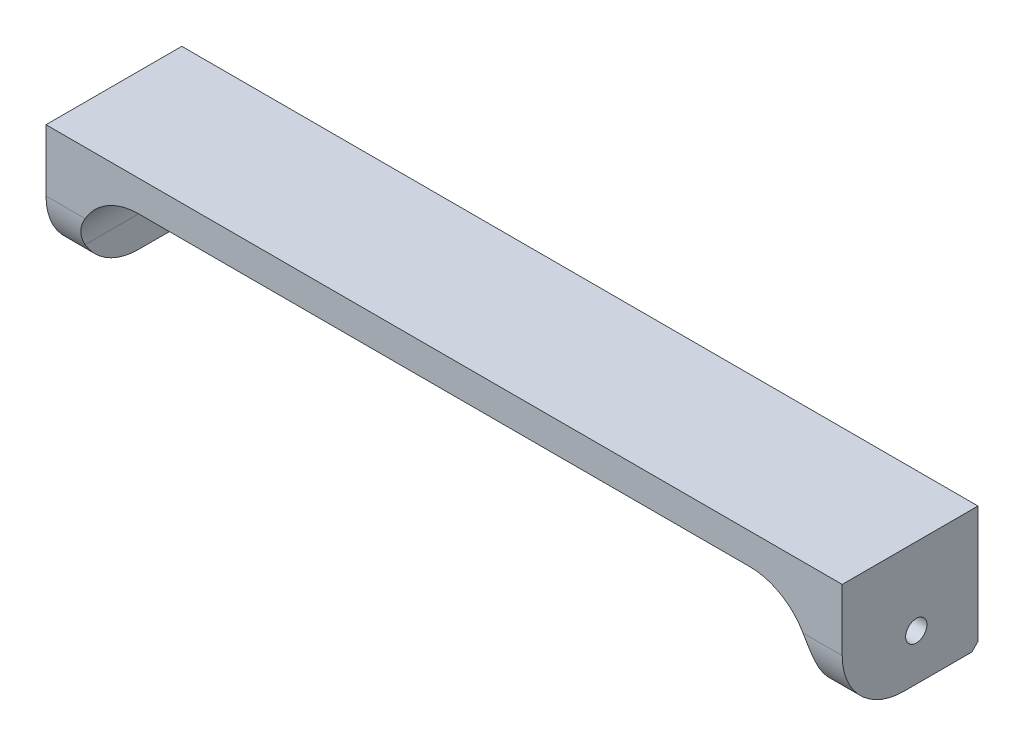
ISO-10303-21;
HEADER;
FILE_DESCRIPTION(('STEP AP214'),'2;1');
FILE_NAME('part.step','',(''),(''),'','','');
FILE_SCHEMA(('AUTOMOTIVE_DESIGN { 1 0 10303 214 1 1 1 1 }'));
ENDSEC;
DATA;
#1=APPLICATION_CONTEXT('core data for automotive mechanical design processes');
#2=APPLICATION_PROTOCOL_DEFINITION('international standard','automotive_design',2000,#1);
#3=PRODUCT_CONTEXT('',#1,'mechanical');
#4=PRODUCT('Part','Part','',(#3));
#5=PRODUCT_RELATED_PRODUCT_CATEGORY('part','',(#4));
#6=PRODUCT_DEFINITION_FORMATION('','',#4);
#7=PRODUCT_DEFINITION_CONTEXT('part definition',#1,'design');
#8=PRODUCT_DEFINITION('design','',#6,#7);
#9=PRODUCT_DEFINITION_SHAPE('','',#8);
#10=(LENGTH_UNIT() NAMED_UNIT(*) SI_UNIT(.MILLI.,.METRE.));
#11=(NAMED_UNIT(*) PLANE_ANGLE_UNIT() SI_UNIT($,.RADIAN.));
#12=(NAMED_UNIT(*) SI_UNIT($,.STERADIAN.) SOLID_ANGLE_UNIT());
#13=UNCERTAINTY_MEASURE_WITH_UNIT(LENGTH_MEASURE(1.E-05),#10,'distance_accuracy_value','');
#14=(GEOMETRIC_REPRESENTATION_CONTEXT(3) GLOBAL_UNCERTAINTY_ASSIGNED_CONTEXT((#13)) GLOBAL_UNIT_ASSIGNED_CONTEXT((#10,
#11,#12)) REPRESENTATION_CONTEXT('',''));
#15=CARTESIAN_POINT('',(0.,0.,0.));
#16=DIRECTION('',(0.,0.,1.));
#17=DIRECTION('',(1.,0.,0.));
#18=AXIS2_PLACEMENT_3D('',#15,#16,#17);
#19=CARTESIAN_POINT('',(49.5,-4.99999999999999,22.));
#20=DIRECTION('',(0.,0.,1.));
#21=DIRECTION('',(1.,0.,0.));
#22=AXIS2_PLACEMENT_3D('',#19,#20,#21);
#23=CYLINDRICAL_SURFACE('',#22,10.);
#24=DIRECTION('',(0.,0.,-1.));
#25=VECTOR('',#24,1.);
#26=CARTESIAN_POINT('',(59.5,-5.,0.));
#27=LINE('',#26,#25);
#28=CARTESIAN_POINT('',(59.5,-5.,20.6602540378444));
#29=VERTEX_POINT('',#28);
#30=CARTESIAN_POINT('',(59.5,-5.,11.260952021292));
#31=VERTEX_POINT('',#30);
#32=EDGE_CURVE('E155',#29,#31,#27,.T.);
#33=ORIENTED_EDGE('',*,*,#32,.F.);
#34=CARTESIAN_POINT('',(59.5,-5.,20.6602540378444));
#35=CARTESIAN_POINT('',(59.5000313996255,-4.81645175072484,20.7662718814835));
#36=CARTESIAN_POINT('',(59.4949471616041,-4.6294539116396,20.86640852136));
#37=CARTESIAN_POINT('',(59.4736335686128,-4.24992862680902,21.0544331322078));
#38=CARTESIAN_POINT('',(59.4573997527731,-4.05739899738466,21.1423161836656));
#39=CARTESIAN_POINT('',(59.4128771806947,-3.66837705293614,21.3052414974577));
#40=CARTESIAN_POINT('',(59.3845914045659,-3.47188572896254,21.3802869277489));
#41=CARTESIAN_POINT('',(59.3153372898342,-3.07662047107035,21.5172543556601));
#42=CARTESIAN_POINT('',(59.2743716752571,-2.87784703624379,21.5791791671904));
#43=CARTESIAN_POINT('',(59.1792412390279,-2.47920724986116,21.6900182662066));
#44=CARTESIAN_POINT('',(59.1250403296062,-2.27933939602253,21.738896203786));
#45=CARTESIAN_POINT('',(59.0033923742944,-1.88087787742971,21.8236341090356));
#46=CARTESIAN_POINT('',(58.9359451159728,-1.68228423316275,21.8594938679073));
#47=CARTESIAN_POINT('',(58.7881365827815,-1.28857892795217,21.9186246526666));
#48=CARTESIAN_POINT('',(58.7078039596746,-1.093460584731,21.9419231197314));
#49=CARTESIAN_POINT('',(58.5345340007195,-0.707935523708524,21.9767859771012));
#50=CARTESIAN_POINT('',(58.4416037679711,-0.517526221766811,21.9883569489533));
#51=CARTESIAN_POINT('',(58.313306088011,-0.274579323430887,21.9963848272747));
#52=CARTESIAN_POINT('',(58.283408887104,-0.219237542971276,21.9977482862739));
#53=CARTESIAN_POINT('',(58.2225971060538,-0.109167232927088,21.9995552900602));
#54=CARTESIAN_POINT('',(58.191683490552,-0.0544381843972345,21.9999996828777));
#55=CARTESIAN_POINT('',(58.1602540378444,0.,22.));
#56=B_SPLINE_CURVE_WITH_KNOTS('',3,(#34,#35,#36,#37,#38,#39,#40,#41,#42,#43,#44,#45,#46,#47,#48,
#49,#50,#51,#52,#53,#54,#55),.UNSPECIFIED.,.F.,.F.,(4,2,2,2,2,2,2,2,2,2,4),(0.,0.63579780688267,
1.27185014041099,1.9077452873184,2.54350391876901,3.18101577473809,3.81853785530785,
4.45466151434951,5.09042797861825,5.27916429152553,5.46772637792503),.UNSPECIFIED.);
#57=CARTESIAN_POINT('',(58.1602540378444,0.,22.));
#58=VERTEX_POINT('',#57);
#59=EDGE_CURVE('E243',#29,#58,#56,.T.);
#60=ORIENTED_EDGE('',*,*,#59,.T.);
#61=CARTESIAN_POINT('',(49.5,-4.99999999999999,22.));
#62=DIRECTION('',(0.,0.,1.));
#63=DIRECTION('',(1.,0.,0.));
#64=AXIS2_PLACEMENT_3D('',#61,#62,#63);
#65=CIRCLE('',#64,10.);
#66=CARTESIAN_POINT('',(49.5,5.00000000000001,22.));
#67=VERTEX_POINT('',#66);
#68=EDGE_CURVE('E467',#67,#58,#65,.F.);
#69=ORIENTED_EDGE('',*,*,#68,.F.);
#70=DIRECTION('',(0.,0.,-1.));
#71=VECTOR('',#70,1.);
#72=CARTESIAN_POINT('',(49.5,5.00000000000001,22.));
#73=LINE('',#72,#71);
#74=CARTESIAN_POINT('',(49.5,5.00000000000001,0.));
#75=VERTEX_POINT('',#74);
#76=EDGE_CURVE('E489',#75,#67,#73,.F.);
#77=ORIENTED_EDGE('',*,*,#76,.F.);
#78=CARTESIAN_POINT('',(49.5,-4.99999999999999,0.));
#79=DIRECTION('',(0.,0.,1.));
#80=DIRECTION('',(1.,0.,0.));
#81=AXIS2_PLACEMENT_3D('',#78,#79,#80);
#82=CIRCLE('',#81,10.);
#83=CARTESIAN_POINT('',(59.5,-5.,0.));
#84=VERTEX_POINT('',#83);
#85=EDGE_CURVE('E484',#84,#75,#82,.T.);
#86=ORIENTED_EDGE('',*,*,#85,.F.);
#87=CARTESIAN_POINT('',(59.5,-5.,8.73904797870805));
#88=VERTEX_POINT('',#87);
#89=EDGE_CURVE('E170',#88,#84,#27,.T.);
#90=ORIENTED_EDGE('',*,*,#89,.F.);
#91=CARTESIAN_POINT('',(59.5,-4.99999999999999,11.260952021292));
#92=CARTESIAN_POINT('',(59.4999973867463,-4.96492431468343,11.3305107861857));
#93=CARTESIAN_POINT('',(59.4998154335005,-4.92693339537108,11.3985967680404));
#94=CARTESIAN_POINT('',(59.4988888952414,-4.84541515394518,11.5313672801061));
#95=CARTESIAN_POINT('',(59.4981442991378,-4.80188772271494,11.5960517432425));
#96=CARTESIAN_POINT('',(59.4958886375171,-4.70959725233564,11.7215533146407));
#97=CARTESIAN_POINT('',(59.4943776604302,-4.66083481774854,11.782370868182));
#98=CARTESIAN_POINT('',(59.4903785869117,-4.55844901411916,11.8996997375435));
#99=CARTESIAN_POINT('',(59.4878905216478,-4.50482580017072,11.9562111906535));
#100=CARTESIAN_POINT('',(59.4786311884034,-4.33711283053827,12.1187753174051));
#101=CARTESIAN_POINT('',(59.47006485791,-4.21618480494194,12.2178508949727));
#102=CARTESIAN_POINT('',(59.4466132924759,-3.96010154435989,12.3942207651938));
#103=CARTESIAN_POINT('',(59.4317316559283,-3.82495444417794,12.4715274198795));
#104=CARTESIAN_POINT('',(59.3947459564103,-3.54620763402557,12.6016958112523));
#105=CARTESIAN_POINT('',(59.372728033577,-3.40272470742232,12.6548317764456));
#106=CARTESIAN_POINT('',(59.3209554907515,-3.11032401053872,12.7368918425359));
#107=CARTESIAN_POINT('',(59.2911992008645,-2.96140507316865,12.7658107118324));
#108=CARTESIAN_POINT('',(59.2240650605842,-2.66201394285165,12.7993801261537));
#109=CARTESIAN_POINT('',(59.1866600063837,-2.51153807837578,12.8039424286632));
#110=CARTESIAN_POINT('',(59.1052011018103,-2.21360694839976,12.789308392677));
#111=CARTESIAN_POINT('',(59.0611463442065,-2.06615209818442,12.7701088097278));
#112=CARTESIAN_POINT('',(58.9655134122424,-1.77054727910196,12.7077361262154));
#113=CARTESIAN_POINT('',(58.9136706974462,-1.62272453956574,12.6634228462849));
#114=CARTESIAN_POINT('',(58.8063791580997,-1.33740802998473,12.5518375392723));
#115=CARTESIAN_POINT('',(58.7509288457252,-1.19991857255845,12.4845559905441));
#116=CARTESIAN_POINT('',(58.634868476433,-0.928451226633865,12.3231317214364));
#117=CARTESIAN_POINT('',(58.5741762721507,-0.795454450956863,12.2273924141804));
#118=CARTESIAN_POINT('',(58.455113155608,-0.54748353076763,12.0135859449758));
#119=CARTESIAN_POINT('',(58.3967435406325,-0.43251935578486,11.8955065110582));
#120=CARTESIAN_POINT('',(58.2854686689007,-0.221926829578968,11.6366554503932));
#121=CARTESIAN_POINT('',(58.2326806561884,-0.126683690409228,11.4955136856779));
#122=CARTESIAN_POINT('',(58.1623444338447,-0.00339686622137607,11.2705558924935));
#123=CARTESIAN_POINT('',(58.140369373719,0.0344420764048502,11.1933435547593));
#124=CARTESIAN_POINT('',(58.0999870668621,0.103117285136862,11.0349930058722));
#125=CARTESIAN_POINT('',(58.0815773856757,0.13395833192093,10.9538575211005));
#126=CARTESIAN_POINT('',(58.0506324488114,0.185314738013805,10.7969754484718));
#127=CARTESIAN_POINT('',(58.0376842291309,0.206572578754994,10.7215524540263));
#128=CARTESIAN_POINT('',(58.0155100687086,0.242760617350762,10.5687063269315));
#129=CARTESIAN_POINT('',(58.0062819298498,0.257694552131386,10.4912844042704));
#130=CARTESIAN_POINT('',(57.9918392867497,0.280990142867814,10.3351367100784));
#131=CARTESIAN_POINT('',(57.986621908106,0.289356505714256,10.2564119136936));
#132=CARTESIAN_POINT('',(57.9803579733412,0.29939194295605,10.0983989865861));
#133=CARTESIAN_POINT('',(57.9793109277248,0.30106180335752,10.0191109230717));
#134=CARTESIAN_POINT('',(57.9822281608218,0.296402209748469,9.8028736431005));
#135=CARTESIAN_POINT('',(57.990404446267,0.283350139354405,9.66604683966399));
#136=CARTESIAN_POINT('',(58.0186245611344,0.237720728982021,9.39705589928348));
#137=CARTESIAN_POINT('',(58.038669813287,0.205141048227536,9.26489232333233));
#138=CARTESIAN_POINT('',(58.0887564797131,0.122069060964691,9.0085989203515));
#139=CARTESIAN_POINT('',(58.1187834853901,0.0716025670449909,8.88445781966848));
#140=CARTESIAN_POINT('',(58.1865608845209,-0.0453841257981608,8.64630582126115));
#141=CARTESIAN_POINT('',(58.224313921795,-0.111909821525908,8.53229841045531));
#142=CARTESIAN_POINT('',(58.3101419675576,-0.268165197312442,8.30280872115382));
#143=CARTESIAN_POINT('',(58.3589142601315,-0.359735092297798,8.1888414974998));
#144=CARTESIAN_POINT('',(58.4601847479527,-0.558430811282544,7.97727920867868));
#145=CARTESIAN_POINT('',(58.5126852129344,-0.665566153857669,7.87969424086045));
#146=CARTESIAN_POINT('',(58.6253050262256,-0.907480315369767,7.69127546678038));
#147=CARTESIAN_POINT('',(58.6855588092391,-1.0440401833761,7.60279674025532));
#148=CARTESIAN_POINT('',(58.8039583930349,-1.33114810553956,7.45045043740445));
#149=CARTESIAN_POINT('',(58.8621036324234,-1.48169984752698,7.38658937250369));
#150=CARTESIAN_POINT('',(58.9748482157962,-1.79749200994406,7.28435470517353));
#151=CARTESIAN_POINT('',(59.0293131957388,-1.96301551444109,7.24669947249562));
#152=CARTESIAN_POINT('',(59.1303488783706,-2.30049171942634,7.20194227505858));
#153=CARTESIAN_POINT('',(59.1769232343268,-2.47244139941196,7.19482613372025));
#154=CARTESIAN_POINT('',(59.2577871599586,-2.80610182052861,7.21209485804036));
#155=CARTESIAN_POINT('',(59.2926684906053,-2.96777034169388,7.23451061701485));
#156=CARTESIAN_POINT('',(59.3533974417547,-3.28628606355523,7.30771121171545));
#157=CARTESIAN_POINT('',(59.379249497594,-3.44313559678971,7.35848208696988));
#158=CARTESIAN_POINT('',(59.4209470408714,-3.73688175480631,7.48325959718369));
#159=CARTESIAN_POINT('',(59.4373196283956,-3.87441285542542,7.555603971632));
#160=CARTESIAN_POINT('',(59.4634834652801,-4.136105742914,7.72244963289508));
#161=CARTESIAN_POINT('',(59.4732716762603,-4.26026133545238,7.8169611216985));
#162=CARTESIAN_POINT('',(59.4876415781314,-4.48996147421638,8.02421314990399));
#163=CARTESIAN_POINT('',(59.492282001419,-4.59570410827075,8.13673093377468));
#164=CARTESIAN_POINT('',(59.4981935309298,-4.7871347469284,8.37748022061786));
#165=CARTESIAN_POINT('',(59.4994720150679,-4.87286628900816,8.50567666749586));
#166=CARTESIAN_POINT('',(59.4999569830575,-4.96563341124719,8.67257020883425));
#167=CARTESIAN_POINT('',(59.499999218331,-4.98315753153753,8.70564570399121));
#168=CARTESIAN_POINT('',(59.5,-4.99999999999999,8.73904797870804));
#169=B_SPLINE_CURVE_WITH_KNOTS('',3,(#91,#92,#93,#94,#95,#96,#97,#98,#99,#100,#101,#102,#103,
#104,#105,#106,#107,#108,#109,#110,#111,#112,#113,#114,#115,#116,#117,#118,#119,#120,#121,#122,
#123,#124,#125,#126,#127,#128,#129,#130,#131,#132,#133,#134,#135,#136,#137,#138,#139,#140,#141,
#142,#143,#144,#145,#146,#147,#148,#149,#150,#151,#152,#153,#154,#155,#156,#157,#158,#159,#160,
#161,#162,#163,#164,#165,#166,#167,#168),.UNSPECIFIED.,.F.,.F.,(4,2,2,2,2,2,2,2,2,2,2,2,2,2,2,2,
2,2,2,2,2,2,2,2,2,2,2,2,2,2,2,2,2,2,2,2,2,2,4),(0.,0.233633471568857,0.467271548430938,
0.700882672671954,0.934486345659042,1.40171894590008,1.86868567876195,2.33021353881773,
2.7918410766784,3.25513993662785,3.71850206249474,4.20481182431061,4.6913234343349,
5.21318684154485,5.73533775762836,6.26688558474981,6.53277929242801,6.79849080171678,
7.03641908037802,7.27420656546421,7.51182347546598,7.74941249421945,8.16028778785591,
8.57121234299825,8.98154628842885,9.39202088415921,9.85254380297994,10.3133495352606,
10.8315547929532,11.3498970231693,11.8819413066303,12.4137385825995,12.9118104115087,
13.4096372336402,13.8761530875584,14.3428840692062,14.8042334108407,15.2645694539867,
15.3768286949783),.UNSPECIFIED.);
#170=EDGE_CURVE('E174',#31,#88,#169,.T.);
#171=ORIENTED_EDGE('',*,*,#170,.F.);
#172=EDGE_LOOP('',(#33,#60,#69,#77,#86,#90,#171));
#173=FACE_BOUND('',#172,.T.);
#174=ADVANCED_FACE('F41',(#173),#23,.F.);
#175=CARTESIAN_POINT('',(-49.5,-5.00000000000001,22.));
#176=DIRECTION('',(0.,0.,1.));
#177=DIRECTION('',(1.,0.,0.));
#178=AXIS2_PLACEMENT_3D('',#175,#176,#177);
#179=CYLINDRICAL_SURFACE('',#178,10.);
#180=CARTESIAN_POINT('',(-49.5,-5.00000000000001,22.));
#181=DIRECTION('',(0.,0.,1.));
#182=DIRECTION('',(1.,0.,0.));
#183=AXIS2_PLACEMENT_3D('',#180,#181,#182);
#184=CIRCLE('',#183,10.);
#185=CARTESIAN_POINT('',(-58.1602540378444,0.,22.));
#186=VERTEX_POINT('',#185);
#187=CARTESIAN_POINT('',(-49.5,4.99999999999999,22.));
#188=VERTEX_POINT('',#187);
#189=EDGE_CURVE('E221',#186,#188,#184,.F.);
#190=ORIENTED_EDGE('',*,*,#189,.F.);
#191=CARTESIAN_POINT('',(-58.1602540378444,0.,22.));
#192=CARTESIAN_POINT('',(-58.2662718814834,-0.183548249275161,22.0000313996255));
#193=CARTESIAN_POINT('',(-58.36640852136,-0.370546088360397,21.9949471616041));
#194=CARTESIAN_POINT('',(-58.5544331322078,-0.75007137319098,21.9736335686128));
#195=CARTESIAN_POINT('',(-58.6423161836655,-0.942601002615339,21.9573997527731));
#196=CARTESIAN_POINT('',(-58.8052414974577,-1.33162294706386,21.9128771806946));
#197=CARTESIAN_POINT('',(-58.8802869277489,-1.52811427103745,21.8845914045659));
#198=CARTESIAN_POINT('',(-59.0172543556601,-1.92337952892964,21.8153372898342));
#199=CARTESIAN_POINT('',(-59.0791791671904,-2.12215296375621,21.7743716752571));
#200=CARTESIAN_POINT('',(-59.1900182662066,-2.52079275013884,21.6792412390279));
#201=CARTESIAN_POINT('',(-59.238896203786,-2.72066060397747,21.6250403296062));
#202=CARTESIAN_POINT('',(-59.3236341090356,-3.11912212257028,21.5033923742944));
#203=CARTESIAN_POINT('',(-59.3594938679073,-3.31771576683725,21.4359451159728));
#204=CARTESIAN_POINT('',(-59.4186246526666,-3.71142107204783,21.2881365827815));
#205=CARTESIAN_POINT('',(-59.4419231197314,-3.90653941526899,21.2078039596746));
#206=CARTESIAN_POINT('',(-59.4767859771012,-4.29206447629147,21.0345340007195));
#207=CARTESIAN_POINT('',(-59.4883569489533,-4.48247377823319,20.9416037679711));
#208=CARTESIAN_POINT('',(-59.4963848272747,-4.72542067656911,20.813306088011));
#209=CARTESIAN_POINT('',(-59.4977482862739,-4.78076245702872,20.783408887104));
#210=CARTESIAN_POINT('',(-59.4995552900602,-4.89083276707291,20.7225971060537));
#211=CARTESIAN_POINT('',(-59.4999996828777,-4.94556181560277,20.6916834905519));
#212=CARTESIAN_POINT('',(-59.5,-5.00000000000001,20.6602540378444));
#213=B_SPLINE_CURVE_WITH_KNOTS('',3,(#191,#192,#193,#194,#195,#196,#197,#198,#199,#200,#201,
#202,#203,#204,#205,#206,#207,#208,#209,#210,#211,#212),.UNSPECIFIED.,.F.,.F.,(4,2,2,2,2,2,2,2,
2,2,4),(0.,0.635797806882667,1.27185014041099,1.90774528731841,2.54350391876901,
3.18101577473809,3.81853785530785,4.4546615143495,5.09042797861825,5.27916429152554,
5.46772637792504),.UNSPECIFIED.);
#214=CARTESIAN_POINT('',(-59.5,-5.00000000000001,20.6602540378444));
#215=VERTEX_POINT('',#214);
#216=EDGE_CURVE('E234',#186,#215,#213,.T.);
#217=ORIENTED_EDGE('',*,*,#216,.T.);
#218=DIRECTION('',(0.,0.,-1.));
#219=VECTOR('',#218,1.);
#220=CARTESIAN_POINT('',(-59.5,-5.00000000000001,22.));
#221=LINE('',#220,#219);
#222=CARTESIAN_POINT('',(-59.5,-5.00000000000001,11.2609520212918));
#223=VERTEX_POINT('',#222);
#224=EDGE_CURVE('E478',#223,#215,#221,.F.);
#225=ORIENTED_EDGE('',*,*,#224,.F.);
#226=CARTESIAN_POINT('',(-59.5,-5.00000000000001,8.73904797870817));
#227=CARTESIAN_POINT('',(-59.4999973867463,-4.96492431468345,8.66948921381447));
#228=CARTESIAN_POINT('',(-59.4998154335004,-4.9269333953711,8.60140323195974));
#229=CARTESIAN_POINT('',(-59.4988888952414,-4.8454151539452,8.46863271989403));
#230=CARTESIAN_POINT('',(-59.4981442991378,-4.80188772271497,8.40394825675761));
#231=CARTESIAN_POINT('',(-59.4958886375171,-4.70959725233568,8.27844668535939));
#232=CARTESIAN_POINT('',(-59.4943776604302,-4.66083481774858,8.21762913181816));
#233=CARTESIAN_POINT('',(-59.4903785869117,-4.5584490141192,8.10030026245665));
#234=CARTESIAN_POINT('',(-59.4878905216478,-4.50482580017076,8.04378880934659));
#235=CARTESIAN_POINT('',(-59.4786311884034,-4.33711283053832,7.88122468259502));
#236=CARTESIAN_POINT('',(-59.47006485791,-4.216184804942,7.7821491050274));
#237=CARTESIAN_POINT('',(-59.4466132924759,-3.96010154435996,7.60577923480629));
#238=CARTESIAN_POINT('',(-59.4317316559283,-3.82495444417801,7.52847258012059));
#239=CARTESIAN_POINT('',(-59.3947459564103,-3.54620763402565,7.39830418874773));
#240=CARTESIAN_POINT('',(-59.372728033577,-3.4027247074224,7.34516822355442));
#241=CARTESIAN_POINT('',(-59.3209554907515,-3.11032401053881,7.26310815746413));
#242=CARTESIAN_POINT('',(-59.2911992008645,-2.96140507316873,7.23418928816765));
#243=CARTESIAN_POINT('',(-59.2240650605842,-2.66201394285173,7.20061987384633));
#244=CARTESIAN_POINT('',(-59.1866600063837,-2.51153807837586,7.1960575713368));
#245=CARTESIAN_POINT('',(-59.1052011018103,-2.21360694839985,7.21069160732294));
#246=CARTESIAN_POINT('',(-59.0611463442065,-2.0661520981845,7.22989119027218));
#247=CARTESIAN_POINT('',(-58.9655134122424,-1.77054727910204,7.29226387378458));
#248=CARTESIAN_POINT('',(-58.9136706974462,-1.62272453956582,7.33657715371505));
#249=CARTESIAN_POINT('',(-58.8063791580997,-1.33740802998481,7.44816246072762));
#250=CARTESIAN_POINT('',(-58.7509288457253,-1.19991857255852,7.51544400945583));
#251=CARTESIAN_POINT('',(-58.634868476433,-0.928451226633933,7.67686827856347));
#252=CARTESIAN_POINT('',(-58.5741762721507,-0.795454450956926,7.77260758581947));
#253=CARTESIAN_POINT('',(-58.455113155608,-0.547483530767685,7.98641405502406));
#254=CARTESIAN_POINT('',(-58.3967435406325,-0.43251935578491,8.1044934889417));
#255=CARTESIAN_POINT('',(-58.2854686689007,-0.221926829579004,8.36334454960668));
#256=CARTESIAN_POINT('',(-58.2326806561884,-0.126683690409255,8.50448631432199));
#257=CARTESIAN_POINT('',(-58.1623444338447,-0.00339686622139049,8.72944410750634));
#258=CARTESIAN_POINT('',(-58.140369373719,0.0344420764048393,8.80665644524058));
#259=CARTESIAN_POINT('',(-58.0999870668621,0.103117285136859,8.96500699412767));
#260=CARTESIAN_POINT('',(-58.0815773856757,0.133958331920932,9.04614247889932));
#261=CARTESIAN_POINT('',(-58.0506324488114,0.185314738013816,9.20302455152809));
#262=CARTESIAN_POINT('',(-58.0376842291309,0.206572578755009,9.27844754597355));
#263=CARTESIAN_POINT('',(-58.0155100687085,0.242760617350786,9.43129367306836));
#264=CARTESIAN_POINT('',(-58.0062819298497,0.257694552131414,9.50871559572946));
#265=CARTESIAN_POINT('',(-57.9918392867496,0.28099014286785,9.66486328992147));
#266=CARTESIAN_POINT('',(-57.986621908106,0.289356505714296,9.74358808630628));
#267=CARTESIAN_POINT('',(-57.9803579733412,0.299391942956098,9.90160101341377));
#268=CARTESIAN_POINT('',(-57.9793109277247,0.301061803357573,9.98088907692814));
#269=CARTESIAN_POINT('',(-57.9822281608217,0.296402209748533,10.1971263568994));
#270=CARTESIAN_POINT('',(-57.9904044462669,0.283350139354474,10.3339531603359));
#271=CARTESIAN_POINT('',(-58.0186245611343,0.237720728982102,10.6029441007164));
#272=CARTESIAN_POINT('',(-58.0386698132869,0.205141048227621,10.7351076766676));
#273=CARTESIAN_POINT('',(-58.0887564797131,0.122069060964787,10.9914010796484));
#274=CARTESIAN_POINT('',(-58.11878348539,0.0716025670450942,11.1155421803314));
#275=CARTESIAN_POINT('',(-58.1865608845208,-0.0453841257980455,11.3536941787387));
#276=CARTESIAN_POINT('',(-58.2243139217949,-0.111909821525787,11.4677015895446));
#277=CARTESIAN_POINT('',(-58.3101419675575,-0.268165197312307,11.6971912788461));
#278=CARTESIAN_POINT('',(-58.3589142601314,-0.359735092297653,11.8111585025001));
#279=CARTESIAN_POINT('',(-58.4601847479526,-0.558430811282384,12.0227207913212));
#280=CARTESIAN_POINT('',(-58.5126852129343,-0.665566153857504,12.1203057591395));
#281=CARTESIAN_POINT('',(-58.6253050262255,-0.907480315369589,12.3087245332195));
#282=CARTESIAN_POINT('',(-58.685558809239,-1.04404018337591,12.3972032597446));
#283=CARTESIAN_POINT('',(-58.8039583930348,-1.33114810553936,12.5495495625955));
#284=CARTESIAN_POINT('',(-58.8621036324233,-1.48169984752678,12.6134106274963));
#285=CARTESIAN_POINT('',(-58.9748482157962,-1.79749200994385,12.7156452948264));
#286=CARTESIAN_POINT('',(-59.0293131957387,-1.96301551444088,12.7533005275043));
#287=CARTESIAN_POINT('',(-59.1303488783705,-2.30049171942613,12.7980577249414));
#288=CARTESIAN_POINT('',(-59.1769232343268,-2.47244139941174,12.8051738662797));
#289=CARTESIAN_POINT('',(-59.2577871599586,-2.8061018205284,12.7879051419597));
#290=CARTESIAN_POINT('',(-59.2926684906053,-2.96777034169368,12.7654893829852));
#291=CARTESIAN_POINT('',(-59.3533974417546,-3.28628606355503,12.6922887882846));
#292=CARTESIAN_POINT('',(-59.379249497594,-3.44313559678952,12.6415179130302));
#293=CARTESIAN_POINT('',(-59.4209470408714,-3.73688175480613,12.5167404028164));
#294=CARTESIAN_POINT('',(-59.4373196283955,-3.87441285542524,12.4443960283681));
#295=CARTESIAN_POINT('',(-59.4634834652801,-4.13610574291383,12.277550367105));
#296=CARTESIAN_POINT('',(-59.4732716762602,-4.26026133545222,12.1830388783016));
#297=CARTESIAN_POINT('',(-59.4876415781313,-4.48996147421623,11.9757868500961));
#298=CARTESIAN_POINT('',(-59.492282001419,-4.5957041082706,11.8632690662254));
#299=CARTESIAN_POINT('',(-59.4981935309298,-4.78713474692826,11.6225197793823));
#300=CARTESIAN_POINT('',(-59.4994720150679,-4.87286628900803,11.4943233325043));
#301=CARTESIAN_POINT('',(-59.4999569830575,-4.96563341124711,11.3274297911658));
#302=CARTESIAN_POINT('',(-59.499999218331,-4.9831575315375,11.2943542960087));
#303=CARTESIAN_POINT('',(-59.5,-5.00000000000001,11.2609520212918));
#304=B_SPLINE_CURVE_WITH_KNOTS('',3,(#226,#227,#228,#229,#230,#231,#232,#233,#234,#235,#236,
#237,#238,#239,#240,#241,#242,#243,#244,#245,#246,#247,#248,#249,#250,#251,#252,#253,#254,#255,
#256,#257,#258,#259,#260,#261,#262,#263,#264,#265,#266,#267,#268,#269,#270,#271,#272,#273,#274,
#275,#276,#277,#278,#279,#280,#281,#282,#283,#284,#285,#286,#287,#288,#289,#290,#291,#292,#293,
#294,#295,#296,#297,#298,#299,#300,#301,#302,#303),.UNSPECIFIED.,.F.,.F.,(4,2,2,2,2,2,2,2,2,2,2,
2,2,2,2,2,2,2,2,2,2,2,2,2,2,2,2,2,2,2,2,2,2,2,2,2,2,2,4),(0.,0.233633471568859,
0.467271548430937,0.700882672671955,0.934486345659043,1.40171894590008,1.86868567876195,
2.33021353881774,2.79184107667841,3.25513993662786,3.71850206249475,4.20481182431061,
4.6913234343349,5.21318684154485,5.73533775762835,6.26688558474981,6.53277929242801,
6.79849080171678,7.03641908037803,7.27420656546422,7.511823475466,7.74941249421947,
8.16028778785594,8.57121234299828,8.98154628842887,9.39202088415923,9.85254380297995,
10.3133495352606,10.8315547929532,11.3498970231693,11.8819413066303,12.4137385825995,
12.9118104115087,13.4096372336403,13.8761530875585,14.3428840692062,14.8042334108407,
15.2645694539867,15.3768286949787),.UNSPECIFIED.);
#305=CARTESIAN_POINT('',(-59.5,-5.,8.73904797870816));
#306=VERTEX_POINT('',#305);
#307=EDGE_CURVE('E212',#306,#223,#304,.T.);
#308=ORIENTED_EDGE('',*,*,#307,.F.);
#309=CARTESIAN_POINT('',(-59.5,-5.00000000000001,0.));
#310=VERTEX_POINT('',#309);
#311=EDGE_CURVE('E477',#310,#306,#221,.F.);
#312=ORIENTED_EDGE('',*,*,#311,.F.);
#313=CARTESIAN_POINT('',(-49.5,-5.00000000000001,0.));
#314=DIRECTION('',(0.,0.,1.));
#315=DIRECTION('',(1.,0.,0.));
#316=AXIS2_PLACEMENT_3D('',#313,#314,#315);
#317=CIRCLE('',#316,10.);
#318=CARTESIAN_POINT('',(-49.5,4.99999999999999,0.));
#319=VERTEX_POINT('',#318);
#320=EDGE_CURVE('E463',#319,#310,#317,.T.);
#321=ORIENTED_EDGE('',*,*,#320,.F.);
#322=DIRECTION('',(0.,0.,-1.));
#323=VECTOR('',#322,1.);
#324=CARTESIAN_POINT('',(-49.5,4.99999999999999,0.));
#325=LINE('',#324,#323);
#326=EDGE_CURVE('E169',#188,#319,#325,.T.);
#327=ORIENTED_EDGE('',*,*,#326,.F.);
#328=EDGE_LOOP('',(#190,#217,#225,#308,#312,#321,#327));
#329=FACE_BOUND('',#328,.T.);
#330=ADVANCED_FACE('F224',(#329),#179,.F.);
#331=CARTESIAN_POINT('',(-64.5,-2.49999999999999,10.));
#332=DIRECTION('',(1.,0.,0.));
#333=DIRECTION('',(0.,0.,-1.));
#334=AXIS2_PLACEMENT_3D('',#331,#332,#333);
#335=CYLINDRICAL_SURFACE('',#334,1.725);
#336=CARTESIAN_POINT('',(64.5,-2.49999999999999,10.));
#337=DIRECTION('',(1.,0.,0.));
#338=DIRECTION('',(0.,0.,-1.));
#339=AXIS2_PLACEMENT_3D('',#336,#337,#338);
#340=CIRCLE('',#339,1.725);
#341=CARTESIAN_POINT('',(64.5,-2.49999999999999,8.275));
#342=VERTEX_POINT('',#341);
#343=EDGE_CURVE('E181',#342,#342,#340,.T.);
#344=ORIENTED_EDGE('',*,*,#343,.T.);
#345=EDGE_LOOP('',(#344));
#346=FACE_BOUND('',#345,.T.);
#347=CARTESIAN_POINT('',(59.5,-2.49999999999999,10.));
#348=DIRECTION('',(-1.,0.,0.));
#349=DIRECTION('',(0.,-1.,0.));
#350=AXIS2_PLACEMENT_3D('',#347,#348,#349);
#351=CIRCLE('',#350,1.725);
#352=CARTESIAN_POINT('',(59.5,-4.225,10.));
#353=VERTEX_POINT('',#352);
#354=EDGE_CURVE('E190',#353,#353,#351,.F.);
#355=ORIENTED_EDGE('',*,*,#354,.F.);
#356=EDGE_LOOP('',(#355));
#357=FACE_BOUND('',#356,.T.);
#358=ADVANCED_FACE('F208',(#346,#357),#335,.F.);
#359=CARTESIAN_POINT('',(59.5,5.00000000000001,22.));
#360=DIRECTION('',(0.,1.,0.));
#361=DIRECTION('',(-1.,0.,0.));
#362=AXIS2_PLACEMENT_3D('',#359,#360,#361);
#363=PLANE('',#362);
#364=DIRECTION('',(1.,0.,0.));
#365=VECTOR('',#364,1.);
#366=CARTESIAN_POINT('',(59.5,5.00000000000001,0.));
#367=LINE('',#366,#365);
#368=EDGE_CURVE('E521',#319,#75,#367,.T.);
#369=ORIENTED_EDGE('',*,*,#368,.T.);
#370=ORIENTED_EDGE('',*,*,#76,.T.);
#371=DIRECTION('',(1.,0.,0.));
#372=VECTOR('',#371,1.);
#373=CARTESIAN_POINT('',(59.5,5.00000000000001,22.));
#374=LINE('',#373,#372);
#375=EDGE_CURVE('E494',#188,#67,#374,.T.);
#376=ORIENTED_EDGE('',*,*,#375,.F.);
#377=ORIENTED_EDGE('',*,*,#326,.T.);
#378=EDGE_LOOP('',(#369,#370,#376,#377));
#379=FACE_BOUND('',#378,.T.);
#380=ADVANCED_FACE('F279',(#379),#363,.F.);
#381=CARTESIAN_POINT('',(59.5,-9.99999999999999,22.));
#382=DIRECTION('',(1.,0.,0.));
#383=DIRECTION('',(0.,1.,0.));
#384=AXIS2_PLACEMENT_3D('',#381,#382,#383);
#385=PLANE('',#384);
#386=DIRECTION('',(0.,-1.,0.));
#387=VECTOR('',#386,1.);
#388=CARTESIAN_POINT('',(59.5,-9.99999999999999,0.));
#389=LINE('',#388,#387);
#390=CARTESIAN_POINT('',(59.5,-8.99999999999999,0.));
#391=VERTEX_POINT('',#390);
#392=EDGE_CURVE('E523',#84,#391,#389,.T.);
#393=ORIENTED_EDGE('',*,*,#392,.T.);
#394=DIRECTION('',(0.,0.707106781186548,-0.707106781186548));
#395=VECTOR('',#394,1.);
#396=CARTESIAN_POINT('',(59.5,-9.99999999999999,1.));
#397=LINE('',#396,#395);
#398=CARTESIAN_POINT('',(59.5,-9.99999999999999,1.));
#399=VERTEX_POINT('',#398);
#400=EDGE_CURVE('E561',#391,#399,#397,.F.);
#401=ORIENTED_EDGE('',*,*,#400,.T.);
#402=DIRECTION('',(0.,0.,-1.));
#403=VECTOR('',#402,1.);
#404=CARTESIAN_POINT('',(59.5,-9.99999999999999,22.));
#405=LINE('',#404,#403);
#406=CARTESIAN_POINT('',(59.5,-9.99999999999999,12.));
#407=VERTEX_POINT('',#406);
#408=EDGE_CURVE('E507',#407,#399,#405,.T.);
#409=ORIENTED_EDGE('',*,*,#408,.F.);
#410=CARTESIAN_POINT('',(59.5,0.,12.));
#411=DIRECTION('',(1.,0.,0.));
#412=DIRECTION('',(0.,1.,0.));
#413=AXIS2_PLACEMENT_3D('',#410,#411,#412);
#414=CIRCLE('',#413,10.);
#415=EDGE_CURVE('E164',#407,#29,#414,.F.);
#416=ORIENTED_EDGE('',*,*,#415,.T.);
#417=ORIENTED_EDGE('',*,*,#32,.T.);
#418=CARTESIAN_POINT('',(59.5,-2.50000000000005,10.));
#419=DIRECTION('',(-1.,0.,0.));
#420=DIRECTION('',(0.,-1.,0.));
#421=AXIS2_PLACEMENT_3D('',#418,#419,#420);
#422=CIRCLE('',#421,2.8);
#423=EDGE_CURVE('E160',#31,#88,#422,.T.);
#424=ORIENTED_EDGE('',*,*,#423,.T.);
#425=ORIENTED_EDGE('',*,*,#89,.T.);
#426=EDGE_LOOP('',(#393,#401,#409,#416,#417,#424,#425));
#427=FACE_BOUND('',#426,.T.);
#428=ORIENTED_EDGE('',*,*,#354,.T.);
#429=EDGE_LOOP('',(#428));
#430=FACE_BOUND('',#429,.T.);
#431=ADVANCED_FACE('F158',(#427,#430),#385,.F.);
#432=CARTESIAN_POINT('',(64.5,-9.99999999999999,22.));
#433=DIRECTION('',(0.,1.,0.));
#434=DIRECTION('',(0.,0.,1.));
#435=AXIS2_PLACEMENT_3D('',#432,#433,#434);
#436=PLANE('',#435);
#437=ORIENTED_EDGE('',*,*,#408,.T.);
#438=DIRECTION('',(1.,0.,0.));
#439=VECTOR('',#438,1.);
#440=CARTESIAN_POINT('',(64.5,-9.99999999999999,1.));
#441=LINE('',#440,#439);
#442=CARTESIAN_POINT('',(64.5,-9.99999999999999,1.));
#443=VERTEX_POINT('',#442);
#444=EDGE_CURVE('E505',#399,#443,#441,.T.);
#445=ORIENTED_EDGE('',*,*,#444,.T.);
#446=DIRECTION('',(0.,0.,-1.));
#447=VECTOR('',#446,1.);
#448=CARTESIAN_POINT('',(64.5,-9.99999999999999,22.));
#449=LINE('',#448,#447);
#450=CARTESIAN_POINT('',(64.5,-9.99999999999999,12.));
#451=VERTEX_POINT('',#450);
#452=EDGE_CURVE('E499',#451,#443,#449,.T.);
#453=ORIENTED_EDGE('',*,*,#452,.F.);
#454=DIRECTION('',(1.,0.,0.));
#455=VECTOR('',#454,1.);
#456=CARTESIAN_POINT('',(59.5,-9.99999999999999,12.));
#457=LINE('',#456,#455);
#458=EDGE_CURVE('E434',#451,#407,#457,.F.);
#459=ORIENTED_EDGE('',*,*,#458,.T.);
#460=EDGE_LOOP('',(#437,#445,#453,#459));
#461=FACE_BOUND('',#460,.T.);
#462=ADVANCED_FACE('F294',(#461),#436,.F.);
#463=CARTESIAN_POINT('',(64.5,9.99999999999999,22.));
#464=DIRECTION('',(-1.,0.,0.));
#465=DIRECTION('',(0.,0.,1.));
#466=AXIS2_PLACEMENT_3D('',#463,#464,#465);
#467=PLANE('',#466);
#468=ORIENTED_EDGE('',*,*,#343,.F.);
#469=EDGE_LOOP('',(#468));
#470=FACE_BOUND('',#469,.T.);
#471=ORIENTED_EDGE('',*,*,#452,.T.);
#472=DIRECTION('',(0.,-0.707106781186548,0.707106781186548));
#473=VECTOR('',#472,1.);
#474=CARTESIAN_POINT('',(64.5,-9.99999999999999,1.));
#475=LINE('',#474,#473);
#476=CARTESIAN_POINT('',(64.5,-8.99999999999999,0.));
#477=VERTEX_POINT('',#476);
#478=EDGE_CURVE('E557',#443,#477,#475,.F.);
#479=ORIENTED_EDGE('',*,*,#478,.T.);
#480=DIRECTION('',(0.,1.,0.));
#481=VECTOR('',#480,1.);
#482=CARTESIAN_POINT('',(64.5,9.99999999999999,0.));
#483=LINE('',#482,#481);
#484=CARTESIAN_POINT('',(64.5,9.99999999999999,0.));
#485=VERTEX_POINT('',#484);
#486=EDGE_CURVE('E528',#477,#485,#483,.T.);
#487=ORIENTED_EDGE('',*,*,#486,.T.);
#488=DIRECTION('',(0.,0.,-1.));
#489=VECTOR('',#488,1.);
#490=CARTESIAN_POINT('',(64.5,9.99999999999999,22.));
#491=LINE('',#490,#489);
#492=CARTESIAN_POINT('',(64.5,9.99999999999999,22.));
#493=VERTEX_POINT('',#492);
#494=EDGE_CURVE('E508',#493,#485,#491,.T.);
#495=ORIENTED_EDGE('',*,*,#494,.F.);
#496=DIRECTION('',(0.,1.,0.));
#497=VECTOR('',#496,1.);
#498=CARTESIAN_POINT('',(64.5,9.99999999999999,22.));
#499=LINE('',#498,#497);
#500=CARTESIAN_POINT('',(64.5,0.,22.));
#501=VERTEX_POINT('',#500);
#502=EDGE_CURVE('E501',#501,#493,#499,.T.);
#503=ORIENTED_EDGE('',*,*,#502,.F.);
#504=CARTESIAN_POINT('',(64.5,0.,12.));
#505=DIRECTION('',(-1.,0.,0.));
#506=DIRECTION('',(0.,0.,1.));
#507=AXIS2_PLACEMENT_3D('',#504,#505,#506);
#508=CIRCLE('',#507,10.);
#509=EDGE_CURVE('E439',#501,#451,#508,.F.);
#510=ORIENTED_EDGE('',*,*,#509,.T.);
#511=EDGE_LOOP('',(#471,#479,#487,#495,#503,#510));
#512=FACE_BOUND('',#511,.T.);
#513=ADVANCED_FACE('F302',(#470,#512),#467,.F.);
#514=CARTESIAN_POINT('',(-64.5,9.99999999999999,22.));
#515=DIRECTION('',(0.,-1.,0.));
#516=DIRECTION('',(0.,0.,-1.));
#517=AXIS2_PLACEMENT_3D('',#514,#515,#516);
#518=PLANE('',#517);
#519=DIRECTION('',(-1.,0.,0.));
#520=VECTOR('',#519,1.);
#521=CARTESIAN_POINT('',(-64.5,9.99999999999999,0.));
#522=LINE('',#521,#520);
#523=CARTESIAN_POINT('',(-64.5,9.99999999999999,0.));
#524=VERTEX_POINT('',#523);
#525=EDGE_CURVE('E532',#485,#524,#522,.T.);
#526=ORIENTED_EDGE('',*,*,#525,.T.);
#527=DIRECTION('',(0.,0.,-1.));
#528=VECTOR('',#527,1.);
#529=CARTESIAN_POINT('',(-64.5,9.99999999999999,22.));
#530=LINE('',#529,#528);
#531=CARTESIAN_POINT('',(-64.5,9.99999999999999,22.));
#532=VERTEX_POINT('',#531);
#533=EDGE_CURVE('E514',#532,#524,#530,.T.);
#534=ORIENTED_EDGE('',*,*,#533,.F.);
#535=DIRECTION('',(-1.,0.,0.));
#536=VECTOR('',#535,1.);
#537=CARTESIAN_POINT('',(-64.5,9.99999999999999,22.));
#538=LINE('',#537,#536);
#539=EDGE_CURVE('E581',#493,#532,#538,.T.);
#540=ORIENTED_EDGE('',*,*,#539,.F.);
#541=ORIENTED_EDGE('',*,*,#494,.T.);
#542=EDGE_LOOP('',(#526,#534,#540,#541));
#543=FACE_BOUND('',#542,.T.);
#544=ADVANCED_FACE('F310',(#543),#518,.F.);
#545=CARTESIAN_POINT('',(-64.5,-10.,22.));
#546=DIRECTION('',(1.,0.,0.));
#547=DIRECTION('',(0.,0.,-1.));
#548=AXIS2_PLACEMENT_3D('',#545,#546,#547);
#549=PLANE('',#548);
#550=CARTESIAN_POINT('',(-64.5,-2.49999999999999,10.));
#551=DIRECTION('',(1.,0.,0.));
#552=DIRECTION('',(0.,0.,-1.));
#553=AXIS2_PLACEMENT_3D('',#550,#551,#552);
#554=CIRCLE('',#553,1.725);
#555=CARTESIAN_POINT('',(-64.5,-2.49999999999999,8.275));
#556=VERTEX_POINT('',#555);
#557=EDGE_CURVE('E187',#556,#556,#554,.T.);
#558=ORIENTED_EDGE('',*,*,#557,.T.);
#559=EDGE_LOOP('',(#558));
#560=FACE_BOUND('',#559,.T.);
#561=DIRECTION('',(0.,-1.,0.));
#562=VECTOR('',#561,1.);
#563=CARTESIAN_POINT('',(-64.5,-10.,0.));
#564=LINE('',#563,#562);
#565=CARTESIAN_POINT('',(-64.5,-9.00000000000001,0.));
#566=VERTEX_POINT('',#565);
#567=EDGE_CURVE('E539',#524,#566,#564,.T.);
#568=ORIENTED_EDGE('',*,*,#567,.T.);
#569=DIRECTION('',(0.,0.707106781186548,-0.707106781186548));
#570=VECTOR('',#569,1.);
#571=CARTESIAN_POINT('',(-64.5,-10.,1.));
#572=LINE('',#571,#570);
#573=CARTESIAN_POINT('',(-64.5,-10.,1.));
#574=VERTEX_POINT('',#573);
#575=EDGE_CURVE('E11',#566,#574,#572,.F.);
#576=ORIENTED_EDGE('',*,*,#575,.T.);
#577=DIRECTION('',(0.,0.,-1.));
#578=VECTOR('',#577,1.);
#579=CARTESIAN_POINT('',(-64.5,-10.,22.));
#580=LINE('',#579,#578);
#581=CARTESIAN_POINT('',(-64.5,-10.,12.));
#582=VERTEX_POINT('',#581);
#583=EDGE_CURVE('E547',#582,#574,#580,.T.);
#584=ORIENTED_EDGE('',*,*,#583,.F.);
#585=CARTESIAN_POINT('',(-64.5,0.,12.));
#586=DIRECTION('',(1.,0.,0.));
#587=DIRECTION('',(0.,0.,-1.));
#588=AXIS2_PLACEMENT_3D('',#585,#586,#587);
#589=CIRCLE('',#588,10.);
#590=CARTESIAN_POINT('',(-64.5,0.,22.));
#591=VERTEX_POINT('',#590);
#592=EDGE_CURVE('E575',#582,#591,#589,.F.);
#593=ORIENTED_EDGE('',*,*,#592,.T.);
#594=DIRECTION('',(0.,-1.,0.));
#595=VECTOR('',#594,1.);
#596=CARTESIAN_POINT('',(-64.5,-10.,22.));
#597=LINE('',#596,#595);
#598=EDGE_CURVE('E456',#532,#591,#597,.T.);
#599=ORIENTED_EDGE('',*,*,#598,.F.);
#600=ORIENTED_EDGE('',*,*,#533,.T.);
#601=EDGE_LOOP('',(#568,#576,#584,#593,#599,#600));
#602=FACE_BOUND('',#601,.T.);
#603=ADVANCED_FACE('F318',(#560,#602),#549,.F.);
#604=CARTESIAN_POINT('',(-59.5,-10.,22.));
#605=DIRECTION('',(0.,1.,0.));
#606=DIRECTION('',(0.,0.,1.));
#607=AXIS2_PLACEMENT_3D('',#604,#605,#606);
#608=PLANE('',#607);
#609=ORIENTED_EDGE('',*,*,#583,.T.);
#610=DIRECTION('',(1.,0.,0.));
#611=VECTOR('',#610,1.);
#612=CARTESIAN_POINT('',(-59.5,-10.,1.));
#613=LINE('',#612,#611);
#614=CARTESIAN_POINT('',(-59.5,-10.,1.));
#615=VERTEX_POINT('',#614);
#616=EDGE_CURVE('E568',#574,#615,#613,.T.);
#617=ORIENTED_EDGE('',*,*,#616,.T.);
#618=DIRECTION('',(0.,0.,-1.));
#619=VECTOR('',#618,1.);
#620=CARTESIAN_POINT('',(-59.5,-10.,22.));
#621=LINE('',#620,#619);
#622=CARTESIAN_POINT('',(-59.5,-10.,12.));
#623=VERTEX_POINT('',#622);
#624=EDGE_CURVE('E544',#623,#615,#621,.T.);
#625=ORIENTED_EDGE('',*,*,#624,.F.);
#626=DIRECTION('',(1.,0.,0.));
#627=VECTOR('',#626,1.);
#628=CARTESIAN_POINT('',(-64.5,-10.,12.));
#629=LINE('',#628,#627);
#630=EDGE_CURVE('E574',#623,#582,#629,.F.);
#631=ORIENTED_EDGE('',*,*,#630,.T.);
#632=EDGE_LOOP('',(#609,#617,#625,#631));
#633=FACE_BOUND('',#632,.T.);
#634=ADVANCED_FACE('F325',(#633),#608,.F.);
#635=CARTESIAN_POINT('',(-59.5,4.99999999999999,22.));
#636=DIRECTION('',(-1.,0.,0.));
#637=DIRECTION('',(0.,0.,1.));
#638=AXIS2_PLACEMENT_3D('',#635,#636,#637);
#639=PLANE('',#638);
#640=ORIENTED_EDGE('',*,*,#624,.T.);
#641=DIRECTION('',(0.,-0.707106781186548,0.707106781186548));
#642=VECTOR('',#641,1.);
#643=CARTESIAN_POINT('',(-59.5,-10.,1.));
#644=LINE('',#643,#642);
#645=CARTESIAN_POINT('',(-59.5,-9.00000000000001,0.));
#646=VERTEX_POINT('',#645);
#647=EDGE_CURVE('E51',#615,#646,#644,.F.);
#648=ORIENTED_EDGE('',*,*,#647,.T.);
#649=DIRECTION('',(0.,1.,0.));
#650=VECTOR('',#649,1.);
#651=CARTESIAN_POINT('',(-59.5,4.99999999999999,0.));
#652=LINE('',#651,#650);
#653=EDGE_CURVE('E482',#646,#310,#652,.T.);
#654=ORIENTED_EDGE('',*,*,#653,.T.);
#655=ORIENTED_EDGE('',*,*,#311,.T.);
#656=CARTESIAN_POINT('',(-59.5,-2.5,10.));
#657=DIRECTION('',(-1.,0.,0.));
#658=DIRECTION('',(0.,-1.,0.));
#659=AXIS2_PLACEMENT_3D('',#656,#657,#658);
#660=CIRCLE('',#659,2.8);
#661=EDGE_CURVE('E177',#223,#306,#660,.T.);
#662=ORIENTED_EDGE('',*,*,#661,.F.);
#663=ORIENTED_EDGE('',*,*,#224,.T.);
#664=CARTESIAN_POINT('',(-59.5,0.,12.));
#665=DIRECTION('',(-1.,0.,0.));
#666=DIRECTION('',(0.,0.,1.));
#667=AXIS2_PLACEMENT_3D('',#664,#665,#666);
#668=CIRCLE('',#667,10.);
#669=EDGE_CURVE('E242',#215,#623,#668,.F.);
#670=ORIENTED_EDGE('',*,*,#669,.T.);
#671=EDGE_LOOP('',(#640,#648,#654,#655,#662,#663,#670));
#672=FACE_BOUND('',#671,.T.);
#673=CARTESIAN_POINT('',(-59.5,-2.49999999999999,10.));
#674=DIRECTION('',(-1.,0.,0.));
#675=DIRECTION('',(0.,-1.,0.));
#676=AXIS2_PLACEMENT_3D('',#673,#674,#675);
#677=CIRCLE('',#676,1.725);
#678=CARTESIAN_POINT('',(-59.5,-4.225,10.));
#679=VERTEX_POINT('',#678);
#680=EDGE_CURVE('E182',#679,#679,#677,.F.);
#681=ORIENTED_EDGE('',*,*,#680,.F.);
#682=EDGE_LOOP('',(#681));
#683=FACE_BOUND('',#682,.T.);
#684=ADVANCED_FACE('F333',(#672,#683),#639,.F.);
#685=CARTESIAN_POINT('',(0.,0.,22.));
#686=DIRECTION('',(0.,0.,1.));
#687=DIRECTION('',(1.,0.,0.));
#688=AXIS2_PLACEMENT_3D('',#685,#686,#687);
#689=PLANE('',#688);
#690=ORIENTED_EDGE('',*,*,#68,.T.);
#691=DIRECTION('',(1.,0.,0.));
#692=VECTOR('',#691,1.);
#693=CARTESIAN_POINT('',(64.5,0.,22.));
#694=LINE('',#693,#692);
#695=EDGE_CURVE('E443',#58,#501,#694,.T.);
#696=ORIENTED_EDGE('',*,*,#695,.T.);
#697=ORIENTED_EDGE('',*,*,#502,.T.);
#698=ORIENTED_EDGE('',*,*,#539,.T.);
#699=ORIENTED_EDGE('',*,*,#598,.T.);
#700=DIRECTION('',(1.,0.,0.));
#701=VECTOR('',#700,1.);
#702=CARTESIAN_POINT('',(-59.5,0.,22.));
#703=LINE('',#702,#701);
#704=EDGE_CURVE('E220',#591,#186,#703,.T.);
#705=ORIENTED_EDGE('',*,*,#704,.T.);
#706=ORIENTED_EDGE('',*,*,#189,.T.);
#707=ORIENTED_EDGE('',*,*,#375,.T.);
#708=EDGE_LOOP('',(#690,#696,#697,#698,#699,#705,#706,#707));
#709=FACE_BOUND('',#708,.T.);
#710=ADVANCED_FACE('F341',(#709),#689,.T.);
#711=CARTESIAN_POINT('',(0.,0.,0.));
#712=DIRECTION('',(0.,0.,1.));
#713=DIRECTION('',(1.,0.,0.));
#714=AXIS2_PLACEMENT_3D('',#711,#712,#713);
#715=PLANE('',#714);
#716=ORIENTED_EDGE('',*,*,#486,.F.);
#717=DIRECTION('',(-1.,0.,0.));
#718=VECTOR('',#717,1.);
#719=CARTESIAN_POINT('',(0.,-8.99999999999999,0.));
#720=LINE('',#719,#718);
#721=EDGE_CURVE('E526',#477,#391,#720,.T.);
#722=ORIENTED_EDGE('',*,*,#721,.T.);
#723=ORIENTED_EDGE('',*,*,#392,.F.);
#724=ORIENTED_EDGE('',*,*,#85,.T.);
#725=ORIENTED_EDGE('',*,*,#368,.F.);
#726=ORIENTED_EDGE('',*,*,#320,.T.);
#727=ORIENTED_EDGE('',*,*,#653,.F.);
#728=DIRECTION('',(-1.,0.,0.));
#729=VECTOR('',#728,1.);
#730=CARTESIAN_POINT('',(0.,-9.00000000000001,0.));
#731=LINE('',#730,#729);
#732=EDGE_CURVE('E555',#646,#566,#731,.T.);
#733=ORIENTED_EDGE('',*,*,#732,.T.);
#734=ORIENTED_EDGE('',*,*,#567,.F.);
#735=ORIENTED_EDGE('',*,*,#525,.F.);
#736=EDGE_LOOP('',(#716,#722,#723,#724,#725,#726,#727,#733,#734,#735));
#737=FACE_BOUND('',#736,.T.);
#738=ADVANCED_FACE('F349',(#737),#715,.F.);
#739=ORIENTED_EDGE('',*,*,#680,.T.);
#740=EDGE_LOOP('',(#739));
#741=FACE_BOUND('',#740,.T.);
#742=ORIENTED_EDGE('',*,*,#557,.F.);
#743=EDGE_LOOP('',(#742));
#744=FACE_BOUND('',#743,.T.);
#745=ADVANCED_FACE('F207',(#741,#744),#335,.F.);
#746=CARTESIAN_POINT('',(-59.5,-2.5,10.));
#747=DIRECTION('',(1.,0.,0.));
#748=DIRECTION('',(0.,1.,0.));
#749=AXIS2_PLACEMENT_3D('',#746,#747,#748);
#750=CYLINDRICAL_SURFACE('',#749,2.8);
#751=ORIENTED_EDGE('',*,*,#170,.T.);
#752=ORIENTED_EDGE('',*,*,#423,.F.);
#753=EDGE_LOOP('',(#751,#752));
#754=FACE_BOUND('',#753,.T.);
#755=ADVANCED_FACE('F173',(#754),#750,.F.);
#756=ORIENTED_EDGE('',*,*,#307,.T.);
#757=ORIENTED_EDGE('',*,*,#661,.T.);
#758=EDGE_LOOP('',(#756,#757));
#759=FACE_BOUND('',#758,.T.);
#760=ADVANCED_FACE('F206',(#759),#750,.F.);
#761=CARTESIAN_POINT('',(0.,0.,12.));
#762=DIRECTION('',(-1.,0.,0.));
#763=DIRECTION('',(0.,0.,1.));
#764=AXIS2_PLACEMENT_3D('',#761,#762,#763);
#765=CYLINDRICAL_SURFACE('',#764,10.);
#766=ORIENTED_EDGE('',*,*,#415,.F.);
#767=ORIENTED_EDGE('',*,*,#458,.F.);
#768=ORIENTED_EDGE('',*,*,#509,.F.);
#769=ORIENTED_EDGE('',*,*,#695,.F.);
#770=ORIENTED_EDGE('',*,*,#59,.F.);
#771=EDGE_LOOP('',(#766,#767,#768,#769,#770));
#772=FACE_BOUND('',#771,.T.);
#773=ADVANCED_FACE('F229',(#772),#765,.T.);
#774=CARTESIAN_POINT('',(0.,0.,12.));
#775=DIRECTION('',(-1.,0.,0.));
#776=DIRECTION('',(0.,0.,1.));
#777=AXIS2_PLACEMENT_3D('',#774,#775,#776);
#778=CYLINDRICAL_SURFACE('',#777,10.);
#779=ORIENTED_EDGE('',*,*,#592,.F.);
#780=ORIENTED_EDGE('',*,*,#630,.F.);
#781=ORIENTED_EDGE('',*,*,#669,.F.);
#782=ORIENTED_EDGE('',*,*,#216,.F.);
#783=ORIENTED_EDGE('',*,*,#704,.F.);
#784=EDGE_LOOP('',(#779,#780,#781,#782,#783));
#785=FACE_BOUND('',#784,.T.);
#786=ADVANCED_FACE('F250',(#785),#778,.T.);
#787=CARTESIAN_POINT('',(64.5,-9.99999999999999,1.));
#788=DIRECTION('',(0.,0.707106781186547,0.707106781186547));
#789=DIRECTION('',(1.,0.,0.));
#790=AXIS2_PLACEMENT_3D('',#787,#788,#789);
#791=PLANE('',#790);
#792=ORIENTED_EDGE('',*,*,#400,.F.);
#793=ORIENTED_EDGE('',*,*,#721,.F.);
#794=ORIENTED_EDGE('',*,*,#478,.F.);
#795=ORIENTED_EDGE('',*,*,#444,.F.);
#796=EDGE_LOOP('',(#792,#793,#794,#795));
#797=FACE_BOUND('',#796,.T.);
#798=ADVANCED_FACE('F253',(#797),#791,.F.);
#799=CARTESIAN_POINT('',(-59.5,-10.,1.));
#800=DIRECTION('',(0.,0.707106781186547,0.707106781186547));
#801=DIRECTION('',(1.,0.,0.));
#802=AXIS2_PLACEMENT_3D('',#799,#800,#801);
#803=PLANE('',#802);
#804=ORIENTED_EDGE('',*,*,#575,.F.);
#805=ORIENTED_EDGE('',*,*,#732,.F.);
#806=ORIENTED_EDGE('',*,*,#647,.F.);
#807=ORIENTED_EDGE('',*,*,#616,.F.);
#808=EDGE_LOOP('',(#804,#805,#806,#807));
#809=FACE_BOUND('',#808,.T.);
#810=ADVANCED_FACE('F44',(#809),#803,.F.);
#811=CLOSED_SHELL('',(#174,#330,#358,#380,#431,#462,#513,#544,#603,#634,#684,#710,#738,#745,
#755,#760,#773,#786,#798,#810));
#812=MANIFOLD_SOLID_BREP('B2',#811);
#813=ADVANCED_BREP_SHAPE_REPRESENTATION('',(#18,#812),#14);
#814=SHAPE_DEFINITION_REPRESENTATION(#9,#813);
ENDSEC;
END-ISO-10303-21;
